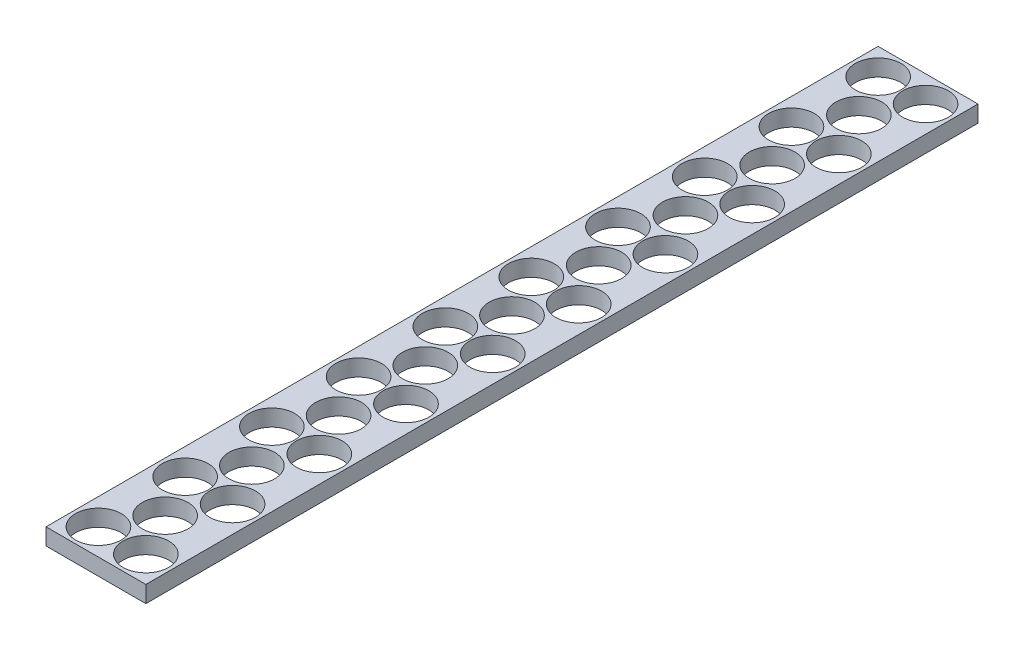
ISO-10303-21;
HEADER;
FILE_DESCRIPTION(('STEP AP214'),'2;1');
FILE_NAME('part.step','',(''),(''),'','','');
FILE_SCHEMA(('AUTOMOTIVE_DESIGN { 1 0 10303 214 1 1 1 1 }'));
ENDSEC;
DATA;
#1=APPLICATION_CONTEXT('core data for automotive mechanical design processes');
#2=APPLICATION_PROTOCOL_DEFINITION('international standard','automotive_design',2000,#1);
#3=PRODUCT_CONTEXT('',#1,'mechanical');
#4=PRODUCT('Part','Part','',(#3));
#5=PRODUCT_RELATED_PRODUCT_CATEGORY('part','',(#4));
#6=PRODUCT_DEFINITION_FORMATION('','',#4);
#7=PRODUCT_DEFINITION_CONTEXT('part definition',#1,'design');
#8=PRODUCT_DEFINITION('design','',#6,#7);
#9=PRODUCT_DEFINITION_SHAPE('','',#8);
#10=(LENGTH_UNIT() NAMED_UNIT(*) SI_UNIT(.MILLI.,.METRE.));
#11=(NAMED_UNIT(*) PLANE_ANGLE_UNIT() SI_UNIT($,.RADIAN.));
#12=(NAMED_UNIT(*) SI_UNIT($,.STERADIAN.) SOLID_ANGLE_UNIT());
#13=UNCERTAINTY_MEASURE_WITH_UNIT(LENGTH_MEASURE(1.E-05),#10,'distance_accuracy_value','');
#14=(GEOMETRIC_REPRESENTATION_CONTEXT(3) GLOBAL_UNCERTAINTY_ASSIGNED_CONTEXT((#13)) GLOBAL_UNIT_ASSIGNED_CONTEXT((#10,
#11,#12)) REPRESENTATION_CONTEXT('',''));
#15=CARTESIAN_POINT('',(0.,0.,0.));
#16=DIRECTION('',(0.,0.,1.));
#17=DIRECTION('',(1.,0.,0.));
#18=AXIS2_PLACEMENT_3D('',#15,#16,#17);
#19=CARTESIAN_POINT('',(18.0975,-6.35100000000001,32.8040655826375));
#20=DIRECTION('',(0.,1.,0.));
#21=DIRECTION('',(-1.,0.,0.));
#22=AXIS2_PLACEMENT_3D('',#19,#20,#21);
#23=CYLINDRICAL_SURFACE('',#22,17.4625);
#24=CARTESIAN_POINT('',(18.0975,-6.35,32.8040655826375));
#25=DIRECTION('',(0.,-1.,0.));
#26=DIRECTION('',(1.,0.,0.));
#27=AXIS2_PLACEMENT_3D('',#24,#25,#26);
#28=CIRCLE('',#27,17.4625);
#29=CARTESIAN_POINT('',(35.56,-6.35,32.8040655826375));
#30=VERTEX_POINT('',#29);
#31=EDGE_CURVE('E49',#30,#30,#28,.F.);
#32=ORIENTED_EDGE('',*,*,#31,.F.);
#33=EDGE_LOOP('',(#32));
#34=FACE_BOUND('',#33,.T.);
#35=CARTESIAN_POINT('',(18.0975,6.35,32.8040655826375));
#36=DIRECTION('',(0.,1.,0.));
#37=DIRECTION('',(-1.,0.,0.));
#38=AXIS2_PLACEMENT_3D('',#35,#36,#37);
#39=CIRCLE('',#38,17.4625);
#40=CARTESIAN_POINT('',(0.635000000000031,6.35,32.8040655826375));
#41=VERTEX_POINT('',#40);
#42=EDGE_CURVE('E11',#41,#41,#39,.T.);
#43=ORIENTED_EDGE('',*,*,#42,.T.);
#44=EDGE_LOOP('',(#43));
#45=FACE_BOUND('',#44,.T.);
#46=ADVANCED_FACE('F41',(#34,#45),#23,.F.);
#47=CARTESIAN_POINT('',(18.0975,-6.35100000000001,98.977424186978));
#48=DIRECTION('',(0.,1.,0.));
#49=DIRECTION('',(-1.,0.,0.));
#50=AXIS2_PLACEMENT_3D('',#47,#48,#49);
#51=CYLINDRICAL_SURFACE('',#50,17.4625);
#52=CARTESIAN_POINT('',(18.0975,-6.35,98.977424186978));
#53=DIRECTION('',(0.,-1.,0.));
#54=DIRECTION('',(1.,0.,0.));
#55=AXIS2_PLACEMENT_3D('',#52,#53,#54);
#56=CIRCLE('',#55,17.4625);
#57=CARTESIAN_POINT('',(35.56,-6.35,98.977424186978));
#58=VERTEX_POINT('',#57);
#59=EDGE_CURVE('E164',#58,#58,#56,.F.);
#60=ORIENTED_EDGE('',*,*,#59,.F.);
#61=EDGE_LOOP('',(#60));
#62=FACE_BOUND('',#61,.T.);
#63=CARTESIAN_POINT('',(18.0975,6.35,98.977424186978));
#64=DIRECTION('',(0.,1.,0.));
#65=DIRECTION('',(-1.,0.,0.));
#66=AXIS2_PLACEMENT_3D('',#63,#64,#65);
#67=CIRCLE('',#66,17.4625);
#68=CARTESIAN_POINT('',(0.635000000000031,6.35,98.977424186978));
#69=VERTEX_POINT('',#68);
#70=EDGE_CURVE('E167',#69,#69,#67,.T.);
#71=ORIENTED_EDGE('',*,*,#70,.T.);
#72=EDGE_LOOP('',(#71));
#73=FACE_BOUND('',#72,.T.);
#74=ADVANCED_FACE('F175',(#62,#73),#51,.F.);
#75=CARTESIAN_POINT('',(18.0975,-6.35100000000001,165.150782791318));
#76=DIRECTION('',(0.,1.,0.));
#77=DIRECTION('',(-1.,0.,0.));
#78=AXIS2_PLACEMENT_3D('',#75,#76,#77);
#79=CYLINDRICAL_SURFACE('',#78,17.4625);
#80=CARTESIAN_POINT('',(18.0975,-6.35,165.150782791318));
#81=DIRECTION('',(0.,-1.,0.));
#82=DIRECTION('',(1.,0.,0.));
#83=AXIS2_PLACEMENT_3D('',#80,#81,#82);
#84=CIRCLE('',#83,17.4625);
#85=CARTESIAN_POINT('',(35.56,-6.35,165.150782791318));
#86=VERTEX_POINT('',#85);
#87=EDGE_CURVE('E158',#86,#86,#84,.F.);
#88=ORIENTED_EDGE('',*,*,#87,.F.);
#89=EDGE_LOOP('',(#88));
#90=FACE_BOUND('',#89,.T.);
#91=CARTESIAN_POINT('',(18.0975,6.35,165.150782791318));
#92=DIRECTION('',(0.,1.,0.));
#93=DIRECTION('',(-1.,0.,0.));
#94=AXIS2_PLACEMENT_3D('',#91,#92,#93);
#95=CIRCLE('',#94,17.4625);
#96=CARTESIAN_POINT('',(0.635000000000031,6.35,165.150782791318));
#97=VERTEX_POINT('',#96);
#98=EDGE_CURVE('E161',#97,#97,#95,.T.);
#99=ORIENTED_EDGE('',*,*,#98,.T.);
#100=EDGE_LOOP('',(#99));
#101=FACE_BOUND('',#100,.T.);
#102=ADVANCED_FACE('F221',(#90,#101),#79,.F.);
#103=CARTESIAN_POINT('',(-18.0975,-6.35100000000001,32.8040655826375));
#104=DIRECTION('',(0.,1.,0.));
#105=DIRECTION('',(-1.,0.,0.));
#106=AXIS2_PLACEMENT_3D('',#103,#104,#105);
#107=CYLINDRICAL_SURFACE('',#106,17.4625);
#108=CARTESIAN_POINT('',(-18.0975,-6.35,32.8040655826375));
#109=DIRECTION('',(0.,-1.,0.));
#110=DIRECTION('',(1.,0.,0.));
#111=AXIS2_PLACEMENT_3D('',#108,#109,#110);
#112=CIRCLE('',#111,17.4625);
#113=CARTESIAN_POINT('',(-0.635000000000031,-6.35,32.8040655826375));
#114=VERTEX_POINT('',#113);
#115=EDGE_CURVE('E152',#114,#114,#112,.F.);
#116=ORIENTED_EDGE('',*,*,#115,.F.);
#117=EDGE_LOOP('',(#116));
#118=FACE_BOUND('',#117,.T.);
#119=CARTESIAN_POINT('',(-18.0975,6.35,32.8040655826375));
#120=DIRECTION('',(0.,1.,0.));
#121=DIRECTION('',(-1.,0.,0.));
#122=AXIS2_PLACEMENT_3D('',#119,#120,#121);
#123=CIRCLE('',#122,17.4625);
#124=CARTESIAN_POINT('',(-35.56,6.34999999999999,32.8040655826375));
#125=VERTEX_POINT('',#124);
#126=EDGE_CURVE('E155',#125,#125,#123,.T.);
#127=ORIENTED_EDGE('',*,*,#126,.T.);
#128=EDGE_LOOP('',(#127));
#129=FACE_BOUND('',#128,.T.);
#130=ADVANCED_FACE('F217',(#118,#129),#107,.F.);
#131=CARTESIAN_POINT('',(-18.0975,-6.35100000000001,98.977424186978));
#132=DIRECTION('',(0.,1.,0.));
#133=DIRECTION('',(-1.,0.,0.));
#134=AXIS2_PLACEMENT_3D('',#131,#132,#133);
#135=CYLINDRICAL_SURFACE('',#134,17.4625);
#136=CARTESIAN_POINT('',(-18.0975,-6.35,98.977424186978));
#137=DIRECTION('',(0.,-1.,0.));
#138=DIRECTION('',(1.,0.,0.));
#139=AXIS2_PLACEMENT_3D('',#136,#137,#138);
#140=CIRCLE('',#139,17.4625);
#141=CARTESIAN_POINT('',(-0.635000000000031,-6.35,98.977424186978));
#142=VERTEX_POINT('',#141);
#143=EDGE_CURVE('E146',#142,#142,#140,.F.);
#144=ORIENTED_EDGE('',*,*,#143,.F.);
#145=EDGE_LOOP('',(#144));
#146=FACE_BOUND('',#145,.T.);
#147=CARTESIAN_POINT('',(-18.0975,6.35,98.977424186978));
#148=DIRECTION('',(0.,1.,0.));
#149=DIRECTION('',(-1.,0.,0.));
#150=AXIS2_PLACEMENT_3D('',#147,#148,#149);
#151=CIRCLE('',#150,17.4625);
#152=CARTESIAN_POINT('',(-35.56,6.34999999999999,98.977424186978));
#153=VERTEX_POINT('',#152);
#154=EDGE_CURVE('E149',#153,#153,#151,.T.);
#155=ORIENTED_EDGE('',*,*,#154,.T.);
#156=EDGE_LOOP('',(#155));
#157=FACE_BOUND('',#156,.T.);
#158=ADVANCED_FACE('F213',(#146,#157),#135,.F.);
#159=CARTESIAN_POINT('',(-18.0975,-6.35100000000001,165.150782791318));
#160=DIRECTION('',(0.,1.,0.));
#161=DIRECTION('',(-1.,0.,0.));
#162=AXIS2_PLACEMENT_3D('',#159,#160,#161);
#163=CYLINDRICAL_SURFACE('',#162,17.4625);
#164=CARTESIAN_POINT('',(-18.0975,-6.35,165.150782791318));
#165=DIRECTION('',(0.,-1.,0.));
#166=DIRECTION('',(1.,0.,0.));
#167=AXIS2_PLACEMENT_3D('',#164,#165,#166);
#168=CIRCLE('',#167,17.4625);
#169=CARTESIAN_POINT('',(-0.635000000000031,-6.35,165.150782791318));
#170=VERTEX_POINT('',#169);
#171=EDGE_CURVE('E140',#170,#170,#168,.F.);
#172=ORIENTED_EDGE('',*,*,#171,.F.);
#173=EDGE_LOOP('',(#172));
#174=FACE_BOUND('',#173,.T.);
#175=CARTESIAN_POINT('',(-18.0975,6.35,165.150782791318));
#176=DIRECTION('',(0.,1.,0.));
#177=DIRECTION('',(-1.,0.,0.));
#178=AXIS2_PLACEMENT_3D('',#175,#176,#177);
#179=CIRCLE('',#178,17.4625);
#180=CARTESIAN_POINT('',(-35.56,6.34999999999999,165.150782791318));
#181=VERTEX_POINT('',#180);
#182=EDGE_CURVE('E143',#181,#181,#179,.T.);
#183=ORIENTED_EDGE('',*,*,#182,.T.);
#184=EDGE_LOOP('',(#183));
#185=FACE_BOUND('',#184,.T.);
#186=ADVANCED_FACE('F209',(#174,#185),#163,.F.);
#187=CARTESIAN_POINT('',(0.,-6.35100000000001,-2.22044604925031E-13));
#188=DIRECTION('',(0.,1.,0.));
#189=DIRECTION('',(-1.,0.,0.));
#190=AXIS2_PLACEMENT_3D('',#187,#188,#189);
#191=CYLINDRICAL_SURFACE('',#190,17.4625);
#192=CARTESIAN_POINT('',(0.,-6.35,-2.22044604925031E-13));
#193=DIRECTION('',(0.,-1.,0.));
#194=DIRECTION('',(1.,0.,0.));
#195=AXIS2_PLACEMENT_3D('',#192,#193,#194);
#196=CIRCLE('',#195,17.4625);
#197=CARTESIAN_POINT('',(17.4625,-6.35,-2.22044604925031E-13));
#198=VERTEX_POINT('',#197);
#199=EDGE_CURVE('E134',#198,#198,#196,.F.);
#200=ORIENTED_EDGE('',*,*,#199,.F.);
#201=EDGE_LOOP('',(#200));
#202=FACE_BOUND('',#201,.T.);
#203=CARTESIAN_POINT('',(0.,6.35,-2.22044604925031E-13));
#204=DIRECTION('',(0.,1.,0.));
#205=DIRECTION('',(-1.,0.,0.));
#206=AXIS2_PLACEMENT_3D('',#203,#204,#205);
#207=CIRCLE('',#206,17.4625);
#208=CARTESIAN_POINT('',(-17.4625,6.35,-2.22044604925031E-13));
#209=VERTEX_POINT('',#208);
#210=EDGE_CURVE('E137',#209,#209,#207,.T.);
#211=ORIENTED_EDGE('',*,*,#210,.T.);
#212=EDGE_LOOP('',(#211));
#213=FACE_BOUND('',#212,.T.);
#214=ADVANCED_FACE('F205',(#202,#213),#191,.F.);
#215=CARTESIAN_POINT('',(0.,-6.35100000000001,66.1733586043402));
#216=DIRECTION('',(0.,1.,0.));
#217=DIRECTION('',(-1.,0.,0.));
#218=AXIS2_PLACEMENT_3D('',#215,#216,#217);
#219=CYLINDRICAL_SURFACE('',#218,17.4625);
#220=CARTESIAN_POINT('',(0.,-6.35,66.1733586043402));
#221=DIRECTION('',(0.,-1.,0.));
#222=DIRECTION('',(1.,0.,0.));
#223=AXIS2_PLACEMENT_3D('',#220,#221,#222);
#224=CIRCLE('',#223,17.4625);
#225=CARTESIAN_POINT('',(17.4625,-6.35,66.1733586043402));
#226=VERTEX_POINT('',#225);
#227=EDGE_CURVE('E128',#226,#226,#224,.F.);
#228=ORIENTED_EDGE('',*,*,#227,.F.);
#229=EDGE_LOOP('',(#228));
#230=FACE_BOUND('',#229,.T.);
#231=CARTESIAN_POINT('',(0.,6.35,66.1733586043402));
#232=DIRECTION('',(0.,1.,0.));
#233=DIRECTION('',(-1.,0.,0.));
#234=AXIS2_PLACEMENT_3D('',#231,#232,#233);
#235=CIRCLE('',#234,17.4625);
#236=CARTESIAN_POINT('',(-17.4625,6.35,66.1733586043402));
#237=VERTEX_POINT('',#236);
#238=EDGE_CURVE('E131',#237,#237,#235,.T.);
#239=ORIENTED_EDGE('',*,*,#238,.T.);
#240=EDGE_LOOP('',(#239));
#241=FACE_BOUND('',#240,.T.);
#242=ADVANCED_FACE('F201',(#230,#241),#219,.F.);
#243=CARTESIAN_POINT('',(0.,-6.35100000000001,132.346717208681));
#244=DIRECTION('',(0.,1.,0.));
#245=DIRECTION('',(-1.,0.,0.));
#246=AXIS2_PLACEMENT_3D('',#243,#244,#245);
#247=CYLINDRICAL_SURFACE('',#246,17.4625);
#248=CARTESIAN_POINT('',(0.,-6.35,132.346717208681));
#249=DIRECTION('',(0.,-1.,0.));
#250=DIRECTION('',(1.,0.,0.));
#251=AXIS2_PLACEMENT_3D('',#248,#249,#250);
#252=CIRCLE('',#251,17.4625);
#253=CARTESIAN_POINT('',(17.4625,-6.35,132.346717208681));
#254=VERTEX_POINT('',#253);
#255=EDGE_CURVE('E120',#254,#254,#252,.F.);
#256=ORIENTED_EDGE('',*,*,#255,.F.);
#257=EDGE_LOOP('',(#256));
#258=FACE_BOUND('',#257,.T.);
#259=CARTESIAN_POINT('',(0.,6.35,132.346717208681));
#260=DIRECTION('',(0.,1.,0.));
#261=DIRECTION('',(-1.,0.,0.));
#262=AXIS2_PLACEMENT_3D('',#259,#260,#261);
#263=CIRCLE('',#262,17.4625);
#264=CARTESIAN_POINT('',(-17.4625,6.35,132.346717208681));
#265=VERTEX_POINT('',#264);
#266=EDGE_CURVE('E125',#265,#265,#263,.T.);
#267=ORIENTED_EDGE('',*,*,#266,.T.);
#268=EDGE_LOOP('',(#267));
#269=FACE_BOUND('',#268,.T.);
#270=ADVANCED_FACE('F188',(#258,#269),#247,.F.);
#271=CARTESIAN_POINT('',(-38.1,6.35,-317.5));
#272=DIRECTION('',(-1.,0.,0.));
#273=DIRECTION('',(0.,0.,1.));
#274=AXIS2_PLACEMENT_3D('',#271,#272,#273);
#275=PLANE('',#274);
#276=DIRECTION('',(0.,-1.,0.));
#277=VECTOR('',#276,1.);
#278=CARTESIAN_POINT('',(-38.1,6.35,317.5));
#279=LINE('',#278,#277);
#280=CARTESIAN_POINT('',(-38.1,6.35,317.5));
#281=VERTEX_POINT('',#280);
#282=CARTESIAN_POINT('',(-38.1,-6.35,317.5));
#283=VERTEX_POINT('',#282);
#284=EDGE_CURVE('E110',#281,#283,#279,.T.);
#285=ORIENTED_EDGE('',*,*,#284,.F.);
#286=DIRECTION('',(0.,0.,1.));
#287=VECTOR('',#286,1.);
#288=CARTESIAN_POINT('',(-38.1,6.35,-317.5));
#289=LINE('',#288,#287);
#290=CARTESIAN_POINT('',(-38.1,6.35,-317.5));
#291=VERTEX_POINT('',#290);
#292=EDGE_CURVE('E57',#291,#281,#289,.T.);
#293=ORIENTED_EDGE('',*,*,#292,.F.);
#294=DIRECTION('',(0.,-1.,0.));
#295=VECTOR('',#294,1.);
#296=CARTESIAN_POINT('',(-38.1,6.35,-317.5));
#297=LINE('',#296,#295);
#298=CARTESIAN_POINT('',(-38.1,-6.35,-317.5));
#299=VERTEX_POINT('',#298);
#300=EDGE_CURVE('E103',#291,#299,#297,.T.);
#301=ORIENTED_EDGE('',*,*,#300,.T.);
#302=DIRECTION('',(0.,0.,1.));
#303=VECTOR('',#302,1.);
#304=CARTESIAN_POINT('',(-38.1,-6.35,-317.5));
#305=LINE('',#304,#303);
#306=EDGE_CURVE('E85',#299,#283,#305,.T.);
#307=ORIENTED_EDGE('',*,*,#306,.T.);
#308=EDGE_LOOP('',(#285,#293,#301,#307));
#309=FACE_BOUND('',#308,.T.);
#310=ADVANCED_FACE('F180',(#309),#275,.T.);
#311=CARTESIAN_POINT('',(38.1,6.35,-317.5));
#312=DIRECTION('',(0.,1.,0.));
#313=DIRECTION('',(-1.,0.,0.));
#314=AXIS2_PLACEMENT_3D('',#311,#312,#313);
#315=PLANE('',#314);
#316=CARTESIAN_POINT('',(18.0975,6.35,-231.324141395659));
#317=DIRECTION('',(0.,-1.,0.));
#318=DIRECTION('',(-1.,0.,0.));
#319=AXIS2_PLACEMENT_3D('',#316,#317,#318);
#320=CIRCLE('',#319,17.4625);
#321=CARTESIAN_POINT('',(0.635000000000031,6.35,-231.324141395659));
#322=VERTEX_POINT('',#321);
#323=EDGE_CURVE('E521',#322,#322,#320,.T.);
#324=ORIENTED_EDGE('',*,*,#323,.T.);
#325=EDGE_LOOP('',(#324));
#326=FACE_BOUND('',#325,.T.);
#327=CARTESIAN_POINT('',(-18.0975,6.35,-165.150782791318));
#328=DIRECTION('',(0.,-1.,0.));
#329=DIRECTION('',(-1.,0.,0.));
#330=AXIS2_PLACEMENT_3D('',#327,#328,#329);
#331=CIRCLE('',#330,17.4625);
#332=CARTESIAN_POINT('',(-35.56,6.34999999999999,-165.150782791318));
#333=VERTEX_POINT('',#332);
#334=EDGE_CURVE('E527',#333,#333,#331,.T.);
#335=ORIENTED_EDGE('',*,*,#334,.T.);
#336=EDGE_LOOP('',(#335));
#337=FACE_BOUND('',#336,.T.);
#338=CARTESIAN_POINT('',(18.0975,6.35,-165.150782791318));
#339=DIRECTION('',(0.,-1.,0.));
#340=DIRECTION('',(-1.,0.,0.));
#341=AXIS2_PLACEMENT_3D('',#338,#339,#340);
#342=CIRCLE('',#341,17.4625);
#343=CARTESIAN_POINT('',(0.635000000000031,6.35,-165.150782791318));
#344=VERTEX_POINT('',#343);
#345=EDGE_CURVE('E697',#344,#344,#342,.T.);
#346=ORIENTED_EDGE('',*,*,#345,.T.);
#347=EDGE_LOOP('',(#346));
#348=FACE_BOUND('',#347,.T.);
#349=CARTESIAN_POINT('',(0.,6.35,-132.346717208681));
#350=DIRECTION('',(0.,-1.,0.));
#351=DIRECTION('',(-1.,0.,0.));
#352=AXIS2_PLACEMENT_3D('',#349,#350,#351);
#353=CIRCLE('',#352,17.4625);
#354=CARTESIAN_POINT('',(-17.4625,6.35,-132.346717208681));
#355=VERTEX_POINT('',#354);
#356=EDGE_CURVE('E702',#355,#355,#353,.T.);
#357=ORIENTED_EDGE('',*,*,#356,.T.);
#358=EDGE_LOOP('',(#357));
#359=FACE_BOUND('',#358,.T.);
#360=CARTESIAN_POINT('',(18.0975,6.35,-297.497499999999));
#361=DIRECTION('',(0.,-1.,0.));
#362=DIRECTION('',(-1.,0.,0.));
#363=AXIS2_PLACEMENT_3D('',#360,#361,#362);
#364=CIRCLE('',#363,17.4625);
#365=CARTESIAN_POINT('',(0.635000000000031,6.35,-297.497499999999));
#366=VERTEX_POINT('',#365);
#367=EDGE_CURVE('E546',#366,#366,#364,.T.);
#368=ORIENTED_EDGE('',*,*,#367,.T.);
#369=EDGE_LOOP('',(#368));
#370=FACE_BOUND('',#369,.T.);
#371=CARTESIAN_POINT('',(0.,6.35,-264.693434417362));
#372=DIRECTION('',(0.,-1.,0.));
#373=DIRECTION('',(-1.,0.,0.));
#374=AXIS2_PLACEMENT_3D('',#371,#372,#373);
#375=CIRCLE('',#374,17.4625);
#376=CARTESIAN_POINT('',(-17.4625,6.35,-264.693434417362));
#377=VERTEX_POINT('',#376);
#378=EDGE_CURVE('E552',#377,#377,#375,.T.);
#379=ORIENTED_EDGE('',*,*,#378,.T.);
#380=EDGE_LOOP('',(#379));
#381=FACE_BOUND('',#380,.T.);
#382=CARTESIAN_POINT('',(0.,6.35,-198.520075813021));
#383=DIRECTION('',(0.,-1.,0.));
#384=DIRECTION('',(-1.,0.,0.));
#385=AXIS2_PLACEMENT_3D('',#382,#383,#384);
#386=CIRCLE('',#385,17.4625);
#387=CARTESIAN_POINT('',(-17.4625,6.35,-198.520075813021));
#388=VERTEX_POINT('',#387);
#389=EDGE_CURVE('E524',#388,#388,#386,.T.);
#390=ORIENTED_EDGE('',*,*,#389,.T.);
#391=EDGE_LOOP('',(#390));
#392=FACE_BOUND('',#391,.T.);
#393=CARTESIAN_POINT('',(-18.0975,6.35,-231.324141395659));
#394=DIRECTION('',(0.,-1.,0.));
#395=DIRECTION('',(-1.,0.,0.));
#396=AXIS2_PLACEMENT_3D('',#393,#394,#395);
#397=CIRCLE('',#396,17.4625);
#398=CARTESIAN_POINT('',(-35.56,6.34999999999999,-231.324141395659));
#399=VERTEX_POINT('',#398);
#400=EDGE_CURVE('E540',#399,#399,#397,.T.);
#401=ORIENTED_EDGE('',*,*,#400,.T.);
#402=EDGE_LOOP('',(#401));
#403=FACE_BOUND('',#402,.T.);
#404=CARTESIAN_POINT('',(18.0975,6.35,-32.8040655826375));
#405=DIRECTION('',(0.,-1.,0.));
#406=DIRECTION('',(-1.,0.,0.));
#407=AXIS2_PLACEMENT_3D('',#404,#405,#406);
#408=CIRCLE('',#407,17.4625);
#409=CARTESIAN_POINT('',(0.635000000000031,6.35,-32.8040655826375));
#410=VERTEX_POINT('',#409);
#411=EDGE_CURVE('E725',#410,#410,#408,.T.);
#412=ORIENTED_EDGE('',*,*,#411,.T.);
#413=EDGE_LOOP('',(#412));
#414=FACE_BOUND('',#413,.T.);
#415=CARTESIAN_POINT('',(0.,6.35,-66.1733586043402));
#416=DIRECTION('',(0.,-1.,0.));
#417=DIRECTION('',(-1.,0.,0.));
#418=AXIS2_PLACEMENT_3D('',#415,#416,#417);
#419=CIRCLE('',#418,17.4625);
#420=CARTESIAN_POINT('',(-17.4625,6.35,-66.1733586043402));
#421=VERTEX_POINT('',#420);
#422=EDGE_CURVE('E689',#421,#421,#419,.T.);
#423=ORIENTED_EDGE('',*,*,#422,.T.);
#424=EDGE_LOOP('',(#423));
#425=FACE_BOUND('',#424,.T.);
#426=CARTESIAN_POINT('',(-18.0975,6.35,-98.977424186978));
#427=DIRECTION('',(0.,-1.,0.));
#428=DIRECTION('',(-1.,0.,0.));
#429=AXIS2_PLACEMENT_3D('',#426,#427,#428);
#430=CIRCLE('',#429,17.4625);
#431=CARTESIAN_POINT('',(-35.56,6.34999999999999,-98.977424186978));
#432=VERTEX_POINT('',#431);
#433=EDGE_CURVE('E693',#432,#432,#430,.T.);
#434=ORIENTED_EDGE('',*,*,#433,.T.);
#435=EDGE_LOOP('',(#434));
#436=FACE_BOUND('',#435,.T.);
#437=CARTESIAN_POINT('',(18.0975,6.35,-98.977424186978));
#438=DIRECTION('',(0.,-1.,0.));
#439=DIRECTION('',(-1.,0.,0.));
#440=AXIS2_PLACEMENT_3D('',#437,#438,#439);
#441=CIRCLE('',#440,17.4625);
#442=CARTESIAN_POINT('',(0.635000000000031,6.35,-98.977424186978));
#443=VERTEX_POINT('',#442);
#444=EDGE_CURVE('E680',#443,#443,#441,.T.);
#445=ORIENTED_EDGE('',*,*,#444,.T.);
#446=EDGE_LOOP('',(#445));
#447=FACE_BOUND('',#446,.T.);
#448=CARTESIAN_POINT('',(-18.0975,6.35,-32.8040655826375));
#449=DIRECTION('',(0.,-1.,0.));
#450=DIRECTION('',(-1.,0.,0.));
#451=AXIS2_PLACEMENT_3D('',#448,#449,#450);
#452=CIRCLE('',#451,17.4625);
#453=CARTESIAN_POINT('',(-35.56,6.34999999999999,-32.8040655826375));
#454=VERTEX_POINT('',#453);
#455=EDGE_CURVE('E681',#454,#454,#452,.T.);
#456=ORIENTED_EDGE('',*,*,#455,.T.);
#457=EDGE_LOOP('',(#456));
#458=FACE_BOUND('',#457,.T.);
#459=CARTESIAN_POINT('',(-18.0975,6.35,-297.497499999999));
#460=DIRECTION('',(0.,-1.,0.));
#461=DIRECTION('',(-1.,0.,0.));
#462=AXIS2_PLACEMENT_3D('',#459,#460,#461);
#463=CIRCLE('',#462,17.4625);
#464=CARTESIAN_POINT('',(-35.56,6.34999999999999,-297.497499999999));
#465=VERTEX_POINT('',#464);
#466=EDGE_CURVE('E558',#465,#465,#463,.T.);
#467=ORIENTED_EDGE('',*,*,#466,.T.);
#468=EDGE_LOOP('',(#467));
#469=FACE_BOUND('',#468,.T.);
#470=CARTESIAN_POINT('',(18.0975,6.35,231.324141395659));
#471=DIRECTION('',(0.,1.,0.));
#472=DIRECTION('',(-1.,0.,0.));
#473=AXIS2_PLACEMENT_3D('',#470,#471,#472);
#474=CIRCLE('',#473,17.4625);
#475=CARTESIAN_POINT('',(0.635000000000031,6.35,231.324141395659));
#476=VERTEX_POINT('',#475);
#477=EDGE_CURVE('E567',#476,#476,#474,.T.);
#478=ORIENTED_EDGE('',*,*,#477,.F.);
#479=EDGE_LOOP('',(#478));
#480=FACE_BOUND('',#479,.T.);
#481=CARTESIAN_POINT('',(-18.0975,6.35,231.324141395659));
#482=DIRECTION('',(0.,1.,0.));
#483=DIRECTION('',(-1.,0.,0.));
#484=AXIS2_PLACEMENT_3D('',#481,#482,#483);
#485=CIRCLE('',#484,17.4625);
#486=CARTESIAN_POINT('',(-35.56,6.34999999999999,231.324141395659));
#487=VERTEX_POINT('',#486);
#488=EDGE_CURVE('E573',#487,#487,#485,.T.);
#489=ORIENTED_EDGE('',*,*,#488,.F.);
#490=EDGE_LOOP('',(#489));
#491=FACE_BOUND('',#490,.T.);
#492=CARTESIAN_POINT('',(0.,6.35,198.520075813021));
#493=DIRECTION('',(0.,1.,0.));
#494=DIRECTION('',(-1.,0.,0.));
#495=AXIS2_PLACEMENT_3D('',#492,#493,#494);
#496=CIRCLE('',#495,17.4625);
#497=CARTESIAN_POINT('',(-17.4625,6.35,198.520075813021));
#498=VERTEX_POINT('',#497);
#499=EDGE_CURVE('E579',#498,#498,#496,.T.);
#500=ORIENTED_EDGE('',*,*,#499,.F.);
#501=EDGE_LOOP('',(#500));
#502=FACE_BOUND('',#501,.T.);
#503=CARTESIAN_POINT('',(0.,6.35,264.693434417362));
#504=DIRECTION('',(0.,1.,0.));
#505=DIRECTION('',(-1.,0.,0.));
#506=AXIS2_PLACEMENT_3D('',#503,#504,#505);
#507=CIRCLE('',#506,17.4625);
#508=CARTESIAN_POINT('',(-17.4625,6.35,264.693434417362));
#509=VERTEX_POINT('',#508);
#510=EDGE_CURVE('E589',#509,#509,#507,.T.);
#511=ORIENTED_EDGE('',*,*,#510,.F.);
#512=EDGE_LOOP('',(#511));
#513=FACE_BOUND('',#512,.T.);
#514=CARTESIAN_POINT('',(18.0975,6.35,297.497499999999));
#515=DIRECTION('',(0.,1.,0.));
#516=DIRECTION('',(-1.,0.,0.));
#517=AXIS2_PLACEMENT_3D('',#514,#515,#516);
#518=CIRCLE('',#517,17.4625);
#519=CARTESIAN_POINT('',(0.635000000000031,6.35,297.497499999999));
#520=VERTEX_POINT('',#519);
#521=EDGE_CURVE('E583',#520,#520,#518,.T.);
#522=ORIENTED_EDGE('',*,*,#521,.F.);
#523=EDGE_LOOP('',(#522));
#524=FACE_BOUND('',#523,.T.);
#525=CARTESIAN_POINT('',(-18.0975,6.35,297.497499999999));
#526=DIRECTION('',(0.,1.,0.));
#527=DIRECTION('',(-1.,0.,0.));
#528=AXIS2_PLACEMENT_3D('',#525,#526,#527);
#529=CIRCLE('',#528,17.4625);
#530=CARTESIAN_POINT('',(-35.56,6.34999999999999,297.497499999999));
#531=VERTEX_POINT('',#530);
#532=EDGE_CURVE('E114',#531,#531,#529,.T.);
#533=ORIENTED_EDGE('',*,*,#532,.F.);
#534=EDGE_LOOP('',(#533));
#535=FACE_BOUND('',#534,.T.);
#536=DIRECTION('',(-1.,0.,0.));
#537=VECTOR('',#536,1.);
#538=CARTESIAN_POINT('',(38.1,6.35,317.5));
#539=LINE('',#538,#537);
#540=CARTESIAN_POINT('',(38.1,6.35,317.5));
#541=VERTEX_POINT('',#540);
#542=EDGE_CURVE('E105',#541,#281,#539,.T.);
#543=ORIENTED_EDGE('',*,*,#542,.F.);
#544=DIRECTION('',(0.,0.,1.));
#545=VECTOR('',#544,1.);
#546=CARTESIAN_POINT('',(38.1,6.35,-317.5));
#547=LINE('',#546,#545);
#548=CARTESIAN_POINT('',(38.1,6.35,-317.5));
#549=VERTEX_POINT('',#548);
#550=EDGE_CURVE('E74',#549,#541,#547,.T.);
#551=ORIENTED_EDGE('',*,*,#550,.F.);
#552=DIRECTION('',(-1.,0.,0.));
#553=VECTOR('',#552,1.);
#554=CARTESIAN_POINT('',(38.1,6.35,-317.5));
#555=LINE('',#554,#553);
#556=EDGE_CURVE('E99',#549,#291,#555,.T.);
#557=ORIENTED_EDGE('',*,*,#556,.T.);
#558=ORIENTED_EDGE('',*,*,#292,.T.);
#559=EDGE_LOOP('',(#543,#551,#557,#558));
#560=FACE_BOUND('',#559,.T.);
#561=ORIENTED_EDGE('',*,*,#266,.F.);
#562=EDGE_LOOP('',(#561));
#563=FACE_BOUND('',#562,.T.);
#564=ORIENTED_EDGE('',*,*,#238,.F.);
#565=EDGE_LOOP('',(#564));
#566=FACE_BOUND('',#565,.T.);
#567=ORIENTED_EDGE('',*,*,#210,.F.);
#568=EDGE_LOOP('',(#567));
#569=FACE_BOUND('',#568,.T.);
#570=ORIENTED_EDGE('',*,*,#182,.F.);
#571=EDGE_LOOP('',(#570));
#572=FACE_BOUND('',#571,.T.);
#573=ORIENTED_EDGE('',*,*,#154,.F.);
#574=EDGE_LOOP('',(#573));
#575=FACE_BOUND('',#574,.T.);
#576=ORIENTED_EDGE('',*,*,#126,.F.);
#577=EDGE_LOOP('',(#576));
#578=FACE_BOUND('',#577,.T.);
#579=ORIENTED_EDGE('',*,*,#98,.F.);
#580=EDGE_LOOP('',(#579));
#581=FACE_BOUND('',#580,.T.);
#582=ORIENTED_EDGE('',*,*,#70,.F.);
#583=EDGE_LOOP('',(#582));
#584=FACE_BOUND('',#583,.T.);
#585=ORIENTED_EDGE('',*,*,#42,.F.);
#586=EDGE_LOOP('',(#585));
#587=FACE_BOUND('',#586,.T.);
#588=ADVANCED_FACE('F178',(#326,#337,#348,#359,#370,#381,#392,#403,#414,#425,#436,#447,#458,
#469,#480,#491,#502,#513,#524,#535,#560,#563,#566,#569,#572,#575,#578,#581,#584,#587),#315,.T.);
#589=CARTESIAN_POINT('',(38.1,6.35,-317.5));
#590=DIRECTION('',(1.,0.,0.));
#591=DIRECTION('',(0.,0.,-1.));
#592=AXIS2_PLACEMENT_3D('',#589,#590,#591);
#593=PLANE('',#592);
#594=DIRECTION('',(0.,1.,0.));
#595=VECTOR('',#594,1.);
#596=CARTESIAN_POINT('',(38.1,6.35,317.5));
#597=LINE('',#596,#595);
#598=CARTESIAN_POINT('',(38.1,-6.35,317.5));
#599=VERTEX_POINT('',#598);
#600=EDGE_CURVE('E93',#599,#541,#597,.T.);
#601=ORIENTED_EDGE('',*,*,#600,.F.);
#602=DIRECTION('',(0.,0.,1.));
#603=VECTOR('',#602,1.);
#604=CARTESIAN_POINT('',(38.1,-6.35,-317.5));
#605=LINE('',#604,#603);
#606=CARTESIAN_POINT('',(38.1,-6.35,-317.5));
#607=VERTEX_POINT('',#606);
#608=EDGE_CURVE('E88',#607,#599,#605,.T.);
#609=ORIENTED_EDGE('',*,*,#608,.F.);
#610=DIRECTION('',(0.,1.,0.));
#611=VECTOR('',#610,1.);
#612=CARTESIAN_POINT('',(38.1,6.35,-317.5));
#613=LINE('',#612,#611);
#614=EDGE_CURVE('E91',#607,#549,#613,.T.);
#615=ORIENTED_EDGE('',*,*,#614,.T.);
#616=ORIENTED_EDGE('',*,*,#550,.T.);
#617=EDGE_LOOP('',(#601,#609,#615,#616));
#618=FACE_BOUND('',#617,.T.);
#619=ADVANCED_FACE('F90',(#618),#593,.T.);
#620=CARTESIAN_POINT('',(38.1,-6.35,-317.5));
#621=DIRECTION('',(0.,-1.,0.));
#622=DIRECTION('',(1.,0.,0.));
#623=AXIS2_PLACEMENT_3D('',#620,#621,#622);
#624=PLANE('',#623);
#625=CARTESIAN_POINT('',(18.0975,-6.35,-231.324141395659));
#626=DIRECTION('',(0.,-1.,0.));
#627=DIRECTION('',(1.,0.,0.));
#628=AXIS2_PLACEMENT_3D('',#625,#626,#627);
#629=CIRCLE('',#628,17.4625);
#630=CARTESIAN_POINT('',(35.56,-6.35,-231.324141395659));
#631=VERTEX_POINT('',#630);
#632=EDGE_CURVE('E519',#631,#631,#629,.T.);
#633=ORIENTED_EDGE('',*,*,#632,.F.);
#634=EDGE_LOOP('',(#633));
#635=FACE_BOUND('',#634,.T.);
#636=CARTESIAN_POINT('',(-18.0975,-6.35,-165.150782791318));
#637=DIRECTION('',(0.,-1.,0.));
#638=DIRECTION('',(1.,0.,0.));
#639=AXIS2_PLACEMENT_3D('',#636,#637,#638);
#640=CIRCLE('',#639,17.4625);
#641=CARTESIAN_POINT('',(-0.635000000000031,-6.35,-165.150782791318));
#642=VERTEX_POINT('',#641);
#643=EDGE_CURVE('E522',#642,#642,#640,.T.);
#644=ORIENTED_EDGE('',*,*,#643,.F.);
#645=EDGE_LOOP('',(#644));
#646=FACE_BOUND('',#645,.T.);
#647=CARTESIAN_POINT('',(18.0975,-6.35,-165.150782791318));
#648=DIRECTION('',(0.,-1.,0.));
#649=DIRECTION('',(1.,0.,0.));
#650=AXIS2_PLACEMENT_3D('',#647,#648,#649);
#651=CIRCLE('',#650,17.4625);
#652=CARTESIAN_POINT('',(35.56,-6.35,-165.150782791318));
#653=VERTEX_POINT('',#652);
#654=EDGE_CURVE('E700',#653,#653,#651,.T.);
#655=ORIENTED_EDGE('',*,*,#654,.F.);
#656=EDGE_LOOP('',(#655));
#657=FACE_BOUND('',#656,.T.);
#658=CARTESIAN_POINT('',(0.,-6.35,-132.346717208681));
#659=DIRECTION('',(0.,-1.,0.));
#660=DIRECTION('',(1.,0.,0.));
#661=AXIS2_PLACEMENT_3D('',#658,#659,#660);
#662=CIRCLE('',#661,17.4625);
#663=CARTESIAN_POINT('',(17.4625,-6.35,-132.346717208681));
#664=VERTEX_POINT('',#663);
#665=EDGE_CURVE('E530',#664,#664,#662,.T.);
#666=ORIENTED_EDGE('',*,*,#665,.F.);
#667=EDGE_LOOP('',(#666));
#668=FACE_BOUND('',#667,.T.);
#669=CARTESIAN_POINT('',(18.0975,-6.35,-297.497499999999));
#670=DIRECTION('',(0.,-1.,0.));
#671=DIRECTION('',(1.,0.,0.));
#672=AXIS2_PLACEMENT_3D('',#669,#670,#671);
#673=CIRCLE('',#672,17.4625);
#674=CARTESIAN_POINT('',(35.56,-6.35,-297.497499999999));
#675=VERTEX_POINT('',#674);
#676=EDGE_CURVE('E549',#675,#675,#673,.T.);
#677=ORIENTED_EDGE('',*,*,#676,.F.);
#678=EDGE_LOOP('',(#677));
#679=FACE_BOUND('',#678,.T.);
#680=CARTESIAN_POINT('',(0.,-6.35,-264.693434417362));
#681=DIRECTION('',(0.,-1.,0.));
#682=DIRECTION('',(1.,0.,0.));
#683=AXIS2_PLACEMENT_3D('',#680,#681,#682);
#684=CIRCLE('',#683,17.4625);
#685=CARTESIAN_POINT('',(17.4625,-6.35,-264.693434417362));
#686=VERTEX_POINT('',#685);
#687=EDGE_CURVE('E555',#686,#686,#684,.T.);
#688=ORIENTED_EDGE('',*,*,#687,.F.);
#689=EDGE_LOOP('',(#688));
#690=FACE_BOUND('',#689,.T.);
#691=CARTESIAN_POINT('',(0.,-6.35,-198.520075813021));
#692=DIRECTION('',(0.,-1.,0.));
#693=DIRECTION('',(1.,0.,0.));
#694=AXIS2_PLACEMENT_3D('',#691,#692,#693);
#695=CIRCLE('',#694,17.4625);
#696=CARTESIAN_POINT('',(17.4625,-6.35,-198.520075813021));
#697=VERTEX_POINT('',#696);
#698=EDGE_CURVE('E537',#697,#697,#695,.T.);
#699=ORIENTED_EDGE('',*,*,#698,.F.);
#700=EDGE_LOOP('',(#699));
#701=FACE_BOUND('',#700,.T.);
#702=CARTESIAN_POINT('',(-18.0975,-6.35,-231.324141395659));
#703=DIRECTION('',(0.,-1.,0.));
#704=DIRECTION('',(1.,0.,0.));
#705=AXIS2_PLACEMENT_3D('',#702,#703,#704);
#706=CIRCLE('',#705,17.4625);
#707=CARTESIAN_POINT('',(-0.635000000000031,-6.35,-231.324141395659));
#708=VERTEX_POINT('',#707);
#709=EDGE_CURVE('E543',#708,#708,#706,.T.);
#710=ORIENTED_EDGE('',*,*,#709,.F.);
#711=EDGE_LOOP('',(#710));
#712=FACE_BOUND('',#711,.T.);
#713=CARTESIAN_POINT('',(18.0975,-6.35,-32.8040655826375));
#714=DIRECTION('',(0.,-1.,0.));
#715=DIRECTION('',(1.,0.,0.));
#716=AXIS2_PLACEMENT_3D('',#713,#714,#715);
#717=CIRCLE('',#716,17.4625);
#718=CARTESIAN_POINT('',(35.56,-6.35,-32.8040655826375));
#719=VERTEX_POINT('',#718);
#720=EDGE_CURVE('E664',#719,#719,#717,.T.);
#721=ORIENTED_EDGE('',*,*,#720,.F.);
#722=EDGE_LOOP('',(#721));
#723=FACE_BOUND('',#722,.T.);
#724=CARTESIAN_POINT('',(0.,-6.35,-66.1733586043402));
#725=DIRECTION('',(0.,-1.,0.));
#726=DIRECTION('',(1.,0.,0.));
#727=AXIS2_PLACEMENT_3D('',#724,#725,#726);
#728=CIRCLE('',#727,17.4625);
#729=CARTESIAN_POINT('',(17.4625,-6.35,-66.1733586043402));
#730=VERTEX_POINT('',#729);
#731=EDGE_CURVE('E668',#730,#730,#728,.T.);
#732=ORIENTED_EDGE('',*,*,#731,.F.);
#733=EDGE_LOOP('',(#732));
#734=FACE_BOUND('',#733,.T.);
#735=CARTESIAN_POINT('',(-18.0975,-6.35,-98.977424186978));
#736=DIRECTION('',(0.,-1.,0.));
#737=DIRECTION('',(1.,0.,0.));
#738=AXIS2_PLACEMENT_3D('',#735,#736,#737);
#739=CIRCLE('',#738,17.4625);
#740=CARTESIAN_POINT('',(-0.635000000000031,-6.35,-98.977424186978));
#741=VERTEX_POINT('',#740);
#742=EDGE_CURVE('E672',#741,#741,#739,.T.);
#743=ORIENTED_EDGE('',*,*,#742,.F.);
#744=EDGE_LOOP('',(#743));
#745=FACE_BOUND('',#744,.T.);
#746=CARTESIAN_POINT('',(18.0975,-6.35,-98.977424186978));
#747=DIRECTION('',(0.,-1.,0.));
#748=DIRECTION('',(1.,0.,0.));
#749=AXIS2_PLACEMENT_3D('',#746,#747,#748);
#750=CIRCLE('',#749,17.4625);
#751=CARTESIAN_POINT('',(35.56,-6.35,-98.977424186978));
#752=VERTEX_POINT('',#751);
#753=EDGE_CURVE('E676',#752,#752,#750,.T.);
#754=ORIENTED_EDGE('',*,*,#753,.F.);
#755=EDGE_LOOP('',(#754));
#756=FACE_BOUND('',#755,.T.);
#757=CARTESIAN_POINT('',(-18.0975,-6.35,-32.8040655826375));
#758=DIRECTION('',(0.,-1.,0.));
#759=DIRECTION('',(1.,0.,0.));
#760=AXIS2_PLACEMENT_3D('',#757,#758,#759);
#761=CIRCLE('',#760,17.4625);
#762=CARTESIAN_POINT('',(-0.635000000000031,-6.35,-32.8040655826375));
#763=VERTEX_POINT('',#762);
#764=EDGE_CURVE('E679',#763,#763,#761,.T.);
#765=ORIENTED_EDGE('',*,*,#764,.F.);
#766=EDGE_LOOP('',(#765));
#767=FACE_BOUND('',#766,.T.);
#768=CARTESIAN_POINT('',(-18.0975,-6.35,-297.497499999999));
#769=DIRECTION('',(0.,-1.,0.));
#770=DIRECTION('',(1.,0.,0.));
#771=AXIS2_PLACEMENT_3D('',#768,#769,#770);
#772=CIRCLE('',#771,17.4625);
#773=CARTESIAN_POINT('',(-0.635000000000031,-6.35,-297.497499999999));
#774=VERTEX_POINT('',#773);
#775=EDGE_CURVE('E561',#774,#774,#772,.T.);
#776=ORIENTED_EDGE('',*,*,#775,.F.);
#777=EDGE_LOOP('',(#776));
#778=FACE_BOUND('',#777,.T.);
#779=CARTESIAN_POINT('',(18.0975,-6.35,231.324141395659));
#780=DIRECTION('',(0.,-1.,0.));
#781=DIRECTION('',(1.,0.,0.));
#782=AXIS2_PLACEMENT_3D('',#779,#780,#781);
#783=CIRCLE('',#782,17.4625);
#784=CARTESIAN_POINT('',(35.56,-6.35,231.324141395659));
#785=VERTEX_POINT('',#784);
#786=EDGE_CURVE('E564',#785,#785,#783,.F.);
#787=ORIENTED_EDGE('',*,*,#786,.T.);
#788=EDGE_LOOP('',(#787));
#789=FACE_BOUND('',#788,.T.);
#790=CARTESIAN_POINT('',(-18.0975,-6.35,231.324141395659));
#791=DIRECTION('',(0.,-1.,0.));
#792=DIRECTION('',(1.,0.,0.));
#793=AXIS2_PLACEMENT_3D('',#790,#791,#792);
#794=CIRCLE('',#793,17.4625);
#795=CARTESIAN_POINT('',(-0.635000000000031,-6.35,231.324141395659));
#796=VERTEX_POINT('',#795);
#797=EDGE_CURVE('E570',#796,#796,#794,.F.);
#798=ORIENTED_EDGE('',*,*,#797,.T.);
#799=EDGE_LOOP('',(#798));
#800=FACE_BOUND('',#799,.T.);
#801=CARTESIAN_POINT('',(0.,-6.35,198.520075813021));
#802=DIRECTION('',(0.,-1.,0.));
#803=DIRECTION('',(1.,0.,0.));
#804=AXIS2_PLACEMENT_3D('',#801,#802,#803);
#805=CIRCLE('',#804,17.4625);
#806=CARTESIAN_POINT('',(17.4625,-6.35,198.520075813021));
#807=VERTEX_POINT('',#806);
#808=EDGE_CURVE('E576',#807,#807,#805,.F.);
#809=ORIENTED_EDGE('',*,*,#808,.T.);
#810=EDGE_LOOP('',(#809));
#811=FACE_BOUND('',#810,.T.);
#812=CARTESIAN_POINT('',(0.,-6.35,264.693434417362));
#813=DIRECTION('',(0.,-1.,0.));
#814=DIRECTION('',(1.,0.,0.));
#815=AXIS2_PLACEMENT_3D('',#812,#813,#814);
#816=CIRCLE('',#815,17.4625);
#817=CARTESIAN_POINT('',(17.4625,-6.35,264.693434417362));
#818=VERTEX_POINT('',#817);
#819=EDGE_CURVE('E586',#818,#818,#816,.F.);
#820=ORIENTED_EDGE('',*,*,#819,.T.);
#821=EDGE_LOOP('',(#820));
#822=FACE_BOUND('',#821,.T.);
#823=CARTESIAN_POINT('',(18.0975,-6.35,297.497499999999));
#824=DIRECTION('',(0.,-1.,0.));
#825=DIRECTION('',(1.,0.,0.));
#826=AXIS2_PLACEMENT_3D('',#823,#824,#825);
#827=CIRCLE('',#826,17.4625);
#828=CARTESIAN_POINT('',(35.56,-6.35,297.497499999999));
#829=VERTEX_POINT('',#828);
#830=EDGE_CURVE('E582',#829,#829,#827,.F.);
#831=ORIENTED_EDGE('',*,*,#830,.T.);
#832=EDGE_LOOP('',(#831));
#833=FACE_BOUND('',#832,.T.);
#834=CARTESIAN_POINT('',(-18.0975,-6.35,297.497499999999));
#835=DIRECTION('',(0.,-1.,0.));
#836=DIRECTION('',(1.,0.,0.));
#837=AXIS2_PLACEMENT_3D('',#834,#835,#836);
#838=CIRCLE('',#837,17.4625);
#839=CARTESIAN_POINT('',(-0.635000000000031,-6.35,297.497499999999));
#840=VERTEX_POINT('',#839);
#841=EDGE_CURVE('E592',#840,#840,#838,.F.);
#842=ORIENTED_EDGE('',*,*,#841,.T.);
#843=EDGE_LOOP('',(#842));
#844=FACE_BOUND('',#843,.T.);
#845=DIRECTION('',(1.,0.,0.));
#846=VECTOR('',#845,1.);
#847=CARTESIAN_POINT('',(38.1,-6.35,317.5));
#848=LINE('',#847,#846);
#849=EDGE_CURVE('E113',#283,#599,#848,.T.);
#850=ORIENTED_EDGE('',*,*,#849,.F.);
#851=ORIENTED_EDGE('',*,*,#306,.F.);
#852=DIRECTION('',(1.,0.,0.));
#853=VECTOR('',#852,1.);
#854=CARTESIAN_POINT('',(38.1,-6.35,-317.5));
#855=LINE('',#854,#853);
#856=EDGE_CURVE('E98',#299,#607,#855,.T.);
#857=ORIENTED_EDGE('',*,*,#856,.T.);
#858=ORIENTED_EDGE('',*,*,#608,.T.);
#859=EDGE_LOOP('',(#850,#851,#857,#858));
#860=FACE_BOUND('',#859,.T.);
#861=ORIENTED_EDGE('',*,*,#255,.T.);
#862=EDGE_LOOP('',(#861));
#863=FACE_BOUND('',#862,.T.);
#864=ORIENTED_EDGE('',*,*,#227,.T.);
#865=EDGE_LOOP('',(#864));
#866=FACE_BOUND('',#865,.T.);
#867=ORIENTED_EDGE('',*,*,#199,.T.);
#868=EDGE_LOOP('',(#867));
#869=FACE_BOUND('',#868,.T.);
#870=ORIENTED_EDGE('',*,*,#171,.T.);
#871=EDGE_LOOP('',(#870));
#872=FACE_BOUND('',#871,.T.);
#873=ORIENTED_EDGE('',*,*,#143,.T.);
#874=EDGE_LOOP('',(#873));
#875=FACE_BOUND('',#874,.T.);
#876=ORIENTED_EDGE('',*,*,#115,.T.);
#877=EDGE_LOOP('',(#876));
#878=FACE_BOUND('',#877,.T.);
#879=ORIENTED_EDGE('',*,*,#87,.T.);
#880=EDGE_LOOP('',(#879));
#881=FACE_BOUND('',#880,.T.);
#882=ORIENTED_EDGE('',*,*,#59,.T.);
#883=EDGE_LOOP('',(#882));
#884=FACE_BOUND('',#883,.T.);
#885=ORIENTED_EDGE('',*,*,#31,.T.);
#886=EDGE_LOOP('',(#885));
#887=FACE_BOUND('',#886,.T.);
#888=ADVANCED_FACE('F101',(#635,#646,#657,#668,#679,#690,#701,#712,#723,#734,#745,#756,#767,
#778,#789,#800,#811,#822,#833,#844,#860,#863,#866,#869,#872,#875,#878,#881,#884,#887),#624,.T.);
#889=CARTESIAN_POINT('',(0.,0.,-317.5));
#890=DIRECTION('',(0.,0.,-1.));
#891=DIRECTION('',(-1.,0.,0.));
#892=AXIS2_PLACEMENT_3D('',#889,#890,#891);
#893=PLANE('',#892);
#894=ORIENTED_EDGE('',*,*,#300,.F.);
#895=ORIENTED_EDGE('',*,*,#556,.F.);
#896=ORIENTED_EDGE('',*,*,#614,.F.);
#897=ORIENTED_EDGE('',*,*,#856,.F.);
#898=EDGE_LOOP('',(#894,#895,#896,#897));
#899=FACE_BOUND('',#898,.T.);
#900=ADVANCED_FACE('F97',(#899),#893,.T.);
#901=CARTESIAN_POINT('',(0.,0.,317.5));
#902=DIRECTION('',(0.,0.,-1.));
#903=DIRECTION('',(-1.,0.,0.));
#904=AXIS2_PLACEMENT_3D('',#901,#902,#903);
#905=PLANE('',#904);
#906=ORIENTED_EDGE('',*,*,#284,.T.);
#907=ORIENTED_EDGE('',*,*,#849,.T.);
#908=ORIENTED_EDGE('',*,*,#600,.T.);
#909=ORIENTED_EDGE('',*,*,#542,.T.);
#910=EDGE_LOOP('',(#906,#907,#908,#909));
#911=FACE_BOUND('',#910,.T.);
#912=ADVANCED_FACE('F193',(#911),#905,.F.);
#913=CARTESIAN_POINT('',(-18.0975,-6.35100000000001,297.497499999999));
#914=DIRECTION('',(0.,1.,0.));
#915=DIRECTION('',(-1.,0.,0.));
#916=AXIS2_PLACEMENT_3D('',#913,#914,#915);
#917=CYLINDRICAL_SURFACE('',#916,17.4625);
#918=ORIENTED_EDGE('',*,*,#841,.F.);
#919=EDGE_LOOP('',(#918));
#920=FACE_BOUND('',#919,.T.);
#921=ORIENTED_EDGE('',*,*,#532,.T.);
#922=EDGE_LOOP('',(#921));
#923=FACE_BOUND('',#922,.T.);
#924=ADVANCED_FACE('F293',(#920,#923),#917,.F.);
#925=CARTESIAN_POINT('',(18.0975,-6.35100000000001,297.497499999999));
#926=DIRECTION('',(0.,1.,0.));
#927=DIRECTION('',(-1.,0.,0.));
#928=AXIS2_PLACEMENT_3D('',#925,#926,#927);
#929=CYLINDRICAL_SURFACE('',#928,17.4625);
#930=ORIENTED_EDGE('',*,*,#830,.F.);
#931=EDGE_LOOP('',(#930));
#932=FACE_BOUND('',#931,.T.);
#933=ORIENTED_EDGE('',*,*,#521,.T.);
#934=EDGE_LOOP('',(#933));
#935=FACE_BOUND('',#934,.T.);
#936=ADVANCED_FACE('F302',(#932,#935),#929,.F.);
#937=CARTESIAN_POINT('',(0.,-6.35100000000001,264.693434417362));
#938=DIRECTION('',(0.,1.,0.));
#939=DIRECTION('',(-1.,0.,0.));
#940=AXIS2_PLACEMENT_3D('',#937,#938,#939);
#941=CYLINDRICAL_SURFACE('',#940,17.4625);
#942=ORIENTED_EDGE('',*,*,#819,.F.);
#943=EDGE_LOOP('',(#942));
#944=FACE_BOUND('',#943,.T.);
#945=ORIENTED_EDGE('',*,*,#510,.T.);
#946=EDGE_LOOP('',(#945));
#947=FACE_BOUND('',#946,.T.);
#948=ADVANCED_FACE('F312',(#944,#947),#941,.F.);
#949=CARTESIAN_POINT('',(0.,-6.35100000000001,198.520075813021));
#950=DIRECTION('',(0.,1.,0.));
#951=DIRECTION('',(-1.,0.,0.));
#952=AXIS2_PLACEMENT_3D('',#949,#950,#951);
#953=CYLINDRICAL_SURFACE('',#952,17.4625);
#954=ORIENTED_EDGE('',*,*,#808,.F.);
#955=EDGE_LOOP('',(#954));
#956=FACE_BOUND('',#955,.T.);
#957=ORIENTED_EDGE('',*,*,#499,.T.);
#958=EDGE_LOOP('',(#957));
#959=FACE_BOUND('',#958,.T.);
#960=ADVANCED_FACE('F321',(#956,#959),#953,.F.);
#961=CARTESIAN_POINT('',(-18.0975,-6.35100000000001,231.324141395659));
#962=DIRECTION('',(0.,1.,0.));
#963=DIRECTION('',(-1.,0.,0.));
#964=AXIS2_PLACEMENT_3D('',#961,#962,#963);
#965=CYLINDRICAL_SURFACE('',#964,17.4625);
#966=ORIENTED_EDGE('',*,*,#797,.F.);
#967=EDGE_LOOP('',(#966));
#968=FACE_BOUND('',#967,.T.);
#969=ORIENTED_EDGE('',*,*,#488,.T.);
#970=EDGE_LOOP('',(#969));
#971=FACE_BOUND('',#970,.T.);
#972=ADVANCED_FACE('F352',(#968,#971),#965,.F.);
#973=CARTESIAN_POINT('',(18.0975,-6.35100000000001,231.324141395659));
#974=DIRECTION('',(0.,1.,0.));
#975=DIRECTION('',(-1.,0.,0.));
#976=AXIS2_PLACEMENT_3D('',#973,#974,#975);
#977=CYLINDRICAL_SURFACE('',#976,17.4625);
#978=ORIENTED_EDGE('',*,*,#786,.F.);
#979=EDGE_LOOP('',(#978));
#980=FACE_BOUND('',#979,.T.);
#981=ORIENTED_EDGE('',*,*,#477,.T.);
#982=EDGE_LOOP('',(#981));
#983=FACE_BOUND('',#982,.T.);
#984=ADVANCED_FACE('F361',(#980,#983),#977,.F.);
#985=CARTESIAN_POINT('',(-18.0975,-6.35100000000001,-297.497499999999));
#986=DIRECTION('',(0.,1.,0.));
#987=DIRECTION('',(-1.,0.,0.));
#988=AXIS2_PLACEMENT_3D('',#985,#986,#987);
#989=CYLINDRICAL_SURFACE('',#988,17.4625);
#990=ORIENTED_EDGE('',*,*,#775,.T.);
#991=EDGE_LOOP('',(#990));
#992=FACE_BOUND('',#991,.T.);
#993=ORIENTED_EDGE('',*,*,#466,.F.);
#994=EDGE_LOOP('',(#993));
#995=FACE_BOUND('',#994,.T.);
#996=ADVANCED_FACE('F370',(#992,#995),#989,.F.);
#997=CARTESIAN_POINT('',(-18.0975,-6.35100000000001,-32.8040655826375));
#998=DIRECTION('',(0.,1.,0.));
#999=DIRECTION('',(-1.,0.,0.));
#1000=AXIS2_PLACEMENT_3D('',#997,#998,#999);
#1001=CYLINDRICAL_SURFACE('',#1000,17.4625);
#1002=ORIENTED_EDGE('',*,*,#764,.T.);
#1003=EDGE_LOOP('',(#1002));
#1004=FACE_BOUND('',#1003,.T.);
#1005=ORIENTED_EDGE('',*,*,#455,.F.);
#1006=EDGE_LOOP('',(#1005));
#1007=FACE_BOUND('',#1006,.T.);
#1008=ADVANCED_FACE('F379',(#1004,#1007),#1001,.F.);
#1009=CARTESIAN_POINT('',(18.0975,-6.35100000000001,-98.977424186978));
#1010=DIRECTION('',(0.,1.,0.));
#1011=DIRECTION('',(-1.,0.,0.));
#1012=AXIS2_PLACEMENT_3D('',#1009,#1010,#1011);
#1013=CYLINDRICAL_SURFACE('',#1012,17.4625);
#1014=ORIENTED_EDGE('',*,*,#753,.T.);
#1015=EDGE_LOOP('',(#1014));
#1016=FACE_BOUND('',#1015,.T.);
#1017=ORIENTED_EDGE('',*,*,#444,.F.);
#1018=EDGE_LOOP('',(#1017));
#1019=FACE_BOUND('',#1018,.T.);
#1020=ADVANCED_FACE('F389',(#1016,#1019),#1013,.F.);
#1021=CARTESIAN_POINT('',(-18.0975,-6.35100000000001,-98.977424186978));
#1022=DIRECTION('',(0.,1.,0.));
#1023=DIRECTION('',(-1.,0.,0.));
#1024=AXIS2_PLACEMENT_3D('',#1021,#1022,#1023);
#1025=CYLINDRICAL_SURFACE('',#1024,17.4625);
#1026=ORIENTED_EDGE('',*,*,#742,.T.);
#1027=EDGE_LOOP('',(#1026));
#1028=FACE_BOUND('',#1027,.T.);
#1029=ORIENTED_EDGE('',*,*,#433,.F.);
#1030=EDGE_LOOP('',(#1029));
#1031=FACE_BOUND('',#1030,.T.);
#1032=ADVANCED_FACE('F398',(#1028,#1031),#1025,.F.);
#1033=CARTESIAN_POINT('',(0.,-6.35100000000001,-66.1733586043402));
#1034=DIRECTION('',(0.,1.,0.));
#1035=DIRECTION('',(-1.,0.,0.));
#1036=AXIS2_PLACEMENT_3D('',#1033,#1034,#1035);
#1037=CYLINDRICAL_SURFACE('',#1036,17.4625);
#1038=ORIENTED_EDGE('',*,*,#731,.T.);
#1039=EDGE_LOOP('',(#1038));
#1040=FACE_BOUND('',#1039,.T.);
#1041=ORIENTED_EDGE('',*,*,#422,.F.);
#1042=EDGE_LOOP('',(#1041));
#1043=FACE_BOUND('',#1042,.T.);
#1044=ADVANCED_FACE('F407',(#1040,#1043),#1037,.F.);
#1045=CARTESIAN_POINT('',(18.0975,-6.35100000000001,-32.8040655826375));
#1046=DIRECTION('',(0.,1.,0.));
#1047=DIRECTION('',(-1.,0.,0.));
#1048=AXIS2_PLACEMENT_3D('',#1045,#1046,#1047);
#1049=CYLINDRICAL_SURFACE('',#1048,17.4625);
#1050=ORIENTED_EDGE('',*,*,#720,.T.);
#1051=EDGE_LOOP('',(#1050));
#1052=FACE_BOUND('',#1051,.T.);
#1053=ORIENTED_EDGE('',*,*,#411,.F.);
#1054=EDGE_LOOP('',(#1053));
#1055=FACE_BOUND('',#1054,.T.);
#1056=ADVANCED_FACE('F416',(#1052,#1055),#1049,.F.);
#1057=CARTESIAN_POINT('',(-18.0975,-6.35100000000001,-231.324141395659));
#1058=DIRECTION('',(0.,1.,0.));
#1059=DIRECTION('',(-1.,0.,0.));
#1060=AXIS2_PLACEMENT_3D('',#1057,#1058,#1059);
#1061=CYLINDRICAL_SURFACE('',#1060,17.4625);
#1062=ORIENTED_EDGE('',*,*,#709,.T.);
#1063=EDGE_LOOP('',(#1062));
#1064=FACE_BOUND('',#1063,.T.);
#1065=ORIENTED_EDGE('',*,*,#400,.F.);
#1066=EDGE_LOOP('',(#1065));
#1067=FACE_BOUND('',#1066,.T.);
#1068=ADVANCED_FACE('F425',(#1064,#1067),#1061,.F.);
#1069=CARTESIAN_POINT('',(0.,-6.35100000000001,-198.520075813021));
#1070=DIRECTION('',(0.,1.,0.));
#1071=DIRECTION('',(-1.,0.,0.));
#1072=AXIS2_PLACEMENT_3D('',#1069,#1070,#1071);
#1073=CYLINDRICAL_SURFACE('',#1072,17.4625);
#1074=ORIENTED_EDGE('',*,*,#698,.T.);
#1075=EDGE_LOOP('',(#1074));
#1076=FACE_BOUND('',#1075,.T.);
#1077=ORIENTED_EDGE('',*,*,#389,.F.);
#1078=EDGE_LOOP('',(#1077));
#1079=FACE_BOUND('',#1078,.T.);
#1080=ADVANCED_FACE('F434',(#1076,#1079),#1073,.F.);
#1081=CARTESIAN_POINT('',(0.,-6.35100000000001,-264.693434417362));
#1082=DIRECTION('',(0.,1.,0.));
#1083=DIRECTION('',(-1.,0.,0.));
#1084=AXIS2_PLACEMENT_3D('',#1081,#1082,#1083);
#1085=CYLINDRICAL_SURFACE('',#1084,17.4625);
#1086=ORIENTED_EDGE('',*,*,#687,.T.);
#1087=EDGE_LOOP('',(#1086));
#1088=FACE_BOUND('',#1087,.T.);
#1089=ORIENTED_EDGE('',*,*,#378,.F.);
#1090=EDGE_LOOP('',(#1089));
#1091=FACE_BOUND('',#1090,.T.);
#1092=ADVANCED_FACE('F443',(#1088,#1091),#1085,.F.);
#1093=CARTESIAN_POINT('',(18.0975,-6.35100000000001,-297.497499999999));
#1094=DIRECTION('',(0.,1.,0.));
#1095=DIRECTION('',(-1.,0.,0.));
#1096=AXIS2_PLACEMENT_3D('',#1093,#1094,#1095);
#1097=CYLINDRICAL_SURFACE('',#1096,17.4625);
#1098=ORIENTED_EDGE('',*,*,#676,.T.);
#1099=EDGE_LOOP('',(#1098));
#1100=FACE_BOUND('',#1099,.T.);
#1101=ORIENTED_EDGE('',*,*,#367,.F.);
#1102=EDGE_LOOP('',(#1101));
#1103=FACE_BOUND('',#1102,.T.);
#1104=ADVANCED_FACE('F452',(#1100,#1103),#1097,.F.);
#1105=CARTESIAN_POINT('',(0.,-6.35100000000001,-132.346717208681));
#1106=DIRECTION('',(0.,1.,0.));
#1107=DIRECTION('',(-1.,0.,0.));
#1108=AXIS2_PLACEMENT_3D('',#1105,#1106,#1107);
#1109=CYLINDRICAL_SURFACE('',#1108,17.4625);
#1110=ORIENTED_EDGE('',*,*,#665,.T.);
#1111=EDGE_LOOP('',(#1110));
#1112=FACE_BOUND('',#1111,.T.);
#1113=ORIENTED_EDGE('',*,*,#356,.F.);
#1114=EDGE_LOOP('',(#1113));
#1115=FACE_BOUND('',#1114,.T.);
#1116=ADVANCED_FACE('F461',(#1112,#1115),#1109,.F.);
#1117=CARTESIAN_POINT('',(18.0975,-6.35100000000001,-165.150782791318));
#1118=DIRECTION('',(0.,1.,0.));
#1119=DIRECTION('',(-1.,0.,0.));
#1120=AXIS2_PLACEMENT_3D('',#1117,#1118,#1119);
#1121=CYLINDRICAL_SURFACE('',#1120,17.4625);
#1122=ORIENTED_EDGE('',*,*,#654,.T.);
#1123=EDGE_LOOP('',(#1122));
#1124=FACE_BOUND('',#1123,.T.);
#1125=ORIENTED_EDGE('',*,*,#345,.F.);
#1126=EDGE_LOOP('',(#1125));
#1127=FACE_BOUND('',#1126,.T.);
#1128=ADVANCED_FACE('F470',(#1124,#1127),#1121,.F.);
#1129=CARTESIAN_POINT('',(-18.0975,-6.35100000000001,-165.150782791318));
#1130=DIRECTION('',(0.,1.,0.));
#1131=DIRECTION('',(-1.,0.,0.));
#1132=AXIS2_PLACEMENT_3D('',#1129,#1130,#1131);
#1133=CYLINDRICAL_SURFACE('',#1132,17.4625);
#1134=ORIENTED_EDGE('',*,*,#643,.T.);
#1135=EDGE_LOOP('',(#1134));
#1136=FACE_BOUND('',#1135,.T.);
#1137=ORIENTED_EDGE('',*,*,#334,.F.);
#1138=EDGE_LOOP('',(#1137));
#1139=FACE_BOUND('',#1138,.T.);
#1140=ADVANCED_FACE('F479',(#1136,#1139),#1133,.F.);
#1141=CARTESIAN_POINT('',(18.0975,-6.35100000000001,-231.324141395659));
#1142=DIRECTION('',(0.,1.,0.));
#1143=DIRECTION('',(-1.,0.,0.));
#1144=AXIS2_PLACEMENT_3D('',#1141,#1142,#1143);
#1145=CYLINDRICAL_SURFACE('',#1144,17.4625);
#1146=ORIENTED_EDGE('',*,*,#632,.T.);
#1147=EDGE_LOOP('',(#1146));
#1148=FACE_BOUND('',#1147,.T.);
#1149=ORIENTED_EDGE('',*,*,#323,.F.);
#1150=EDGE_LOOP('',(#1149));
#1151=FACE_BOUND('',#1150,.T.);
#1152=ADVANCED_FACE('F488',(#1148,#1151),#1145,.F.);
#1153=CLOSED_SHELL('',(#46,#74,#102,#130,#158,#186,#214,#242,#270,#310,#588,#619,#888,#900,#912,
#924,#936,#948,#960,#972,#984,#996,#1008,#1020,#1032,#1044,#1056,#1068,#1080,#1092,#1104,#1116,
#1128,#1140,#1152));
#1154=MANIFOLD_SOLID_BREP('B2',#1153);
#1155=ADVANCED_BREP_SHAPE_REPRESENTATION('',(#18,#1154),#14);
#1156=SHAPE_DEFINITION_REPRESENTATION(#9,#1155);
ENDSEC;
END-ISO-10303-21;
